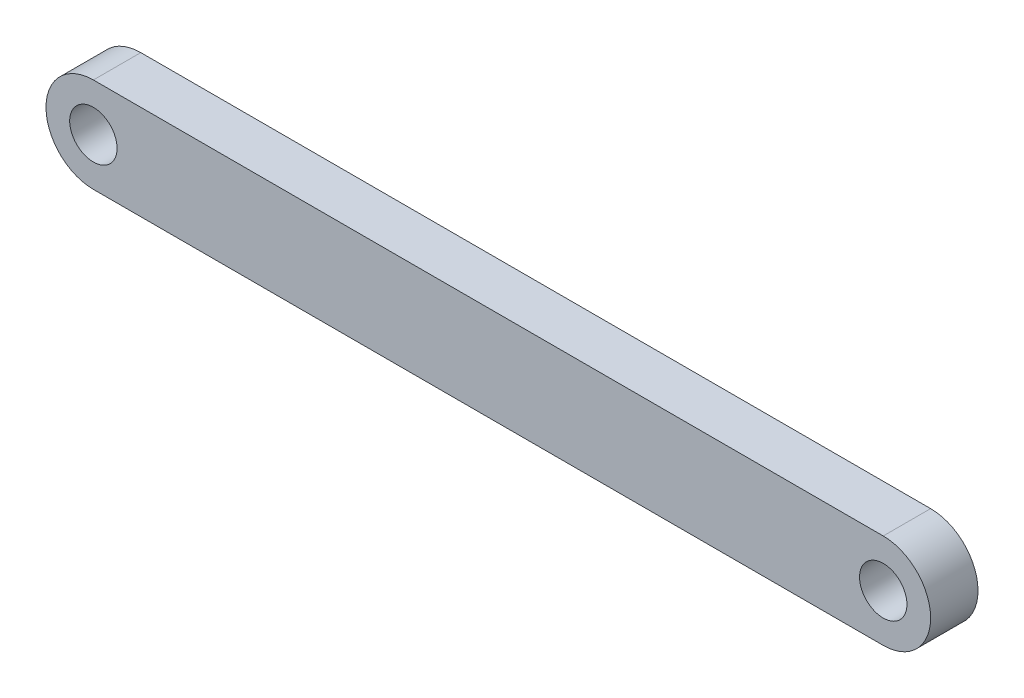
ISO-10303-21;
HEADER;
FILE_DESCRIPTION(('STEP AP214'),'2;1');
FILE_NAME('part.step','',(''),(''),'','','');
FILE_SCHEMA(('AUTOMOTIVE_DESIGN { 1 0 10303 214 1 1 1 1 }'));
ENDSEC;
DATA;
#1=APPLICATION_CONTEXT('core data for automotive mechanical design processes');
#2=APPLICATION_PROTOCOL_DEFINITION('international standard','automotive_design',2000,#1);
#3=PRODUCT_CONTEXT('',#1,'mechanical');
#4=PRODUCT('Part','Part','',(#3));
#5=PRODUCT_RELATED_PRODUCT_CATEGORY('part','',(#4));
#6=PRODUCT_DEFINITION_FORMATION('','',#4);
#7=PRODUCT_DEFINITION_CONTEXT('part definition',#1,'design');
#8=PRODUCT_DEFINITION('design','',#6,#7);
#9=PRODUCT_DEFINITION_SHAPE('','',#8);
#10=(LENGTH_UNIT() NAMED_UNIT(*) SI_UNIT(.MILLI.,.METRE.));
#11=(NAMED_UNIT(*) PLANE_ANGLE_UNIT() SI_UNIT($,.RADIAN.));
#12=(NAMED_UNIT(*) SI_UNIT($,.STERADIAN.) SOLID_ANGLE_UNIT());
#13=UNCERTAINTY_MEASURE_WITH_UNIT(LENGTH_MEASURE(1.E-05),#10,'distance_accuracy_value','');
#14=(GEOMETRIC_REPRESENTATION_CONTEXT(3) GLOBAL_UNCERTAINTY_ASSIGNED_CONTEXT((#13)) GLOBAL_UNIT_ASSIGNED_CONTEXT((#10,
#11,#12)) REPRESENTATION_CONTEXT('',''));
#15=CARTESIAN_POINT('',(0.,0.,0.));
#16=DIRECTION('',(0.,0.,1.));
#17=DIRECTION('',(1.,0.,0.));
#18=AXIS2_PLACEMENT_3D('',#15,#16,#17);
#19=CARTESIAN_POINT('',(0.,0.,3.));
#20=DIRECTION('',(0.,0.,1.));
#21=DIRECTION('',(1.,0.,0.));
#22=AXIS2_PLACEMENT_3D('',#19,#20,#21);
#23=PLANE('',#22);
#24=CARTESIAN_POINT('',(-50.,0.,3.));
#25=DIRECTION('',(0.,0.,1.));
#26=DIRECTION('',(1.,0.,0.));
#27=AXIS2_PLACEMENT_3D('',#24,#25,#26);
#28=CIRCLE('',#27,1.5);
#29=CARTESIAN_POINT('',(-48.5,0.,3.));
#30=VERTEX_POINT('',#29);
#31=EDGE_CURVE('E112',#30,#30,#28,.T.);
#32=ORIENTED_EDGE('',*,*,#31,.F.);
#33=EDGE_LOOP('',(#32));
#34=FACE_BOUND('',#33,.T.);
#35=CARTESIAN_POINT('',(0.,0.,3.));
#36=DIRECTION('',(0.,0.,1.));
#37=DIRECTION('',(1.,0.,0.));
#38=AXIS2_PLACEMENT_3D('',#35,#36,#37);
#39=CIRCLE('',#38,3.);
#40=CARTESIAN_POINT('',(0.,-3.,3.));
#41=VERTEX_POINT('',#40);
#42=CARTESIAN_POINT('',(0.,3.,3.));
#43=VERTEX_POINT('',#42);
#44=EDGE_CURVE('E92',#41,#43,#39,.T.);
#45=ORIENTED_EDGE('',*,*,#44,.T.);
#46=DIRECTION('',(-1.,0.,0.));
#47=VECTOR('',#46,1.);
#48=CARTESIAN_POINT('',(-50.,2.99999999999999,3.));
#49=LINE('',#48,#47);
#50=CARTESIAN_POINT('',(-50.,2.99999999999999,3.));
#51=VERTEX_POINT('',#50);
#52=EDGE_CURVE('E87',#43,#51,#49,.T.);
#53=ORIENTED_EDGE('',*,*,#52,.T.);
#54=CARTESIAN_POINT('',(-50.,0.,3.));
#55=DIRECTION('',(0.,0.,1.));
#56=DIRECTION('',(1.,0.,0.));
#57=AXIS2_PLACEMENT_3D('',#54,#55,#56);
#58=CIRCLE('',#57,3.);
#59=CARTESIAN_POINT('',(-50.,-3.00000000000001,3.));
#60=VERTEX_POINT('',#59);
#61=EDGE_CURVE('E90',#51,#60,#58,.T.);
#62=ORIENTED_EDGE('',*,*,#61,.T.);
#63=DIRECTION('',(1.,0.,0.));
#64=VECTOR('',#63,1.);
#65=CARTESIAN_POINT('',(-50.,-3.00000000000001,3.));
#66=LINE('',#65,#64);
#67=EDGE_CURVE('E57',#60,#41,#66,.T.);
#68=ORIENTED_EDGE('',*,*,#67,.T.);
#69=EDGE_LOOP('',(#45,#53,#62,#68));
#70=FACE_BOUND('',#69,.T.);
#71=CARTESIAN_POINT('',(0.,0.,3.));
#72=DIRECTION('',(0.,0.,1.));
#73=DIRECTION('',(1.,0.,0.));
#74=AXIS2_PLACEMENT_3D('',#71,#72,#73);
#75=CIRCLE('',#74,1.5);
#76=CARTESIAN_POINT('',(1.5,0.,3.));
#77=VERTEX_POINT('',#76);
#78=EDGE_CURVE('E134',#77,#77,#75,.T.);
#79=ORIENTED_EDGE('',*,*,#78,.F.);
#80=EDGE_LOOP('',(#79));
#81=FACE_BOUND('',#80,.T.);
#82=ADVANCED_FACE('F39',(#34,#70,#81),#23,.T.);
#83=CARTESIAN_POINT('',(0.,0.,0.));
#84=DIRECTION('',(0.,0.,1.));
#85=DIRECTION('',(1.,0.,0.));
#86=AXIS2_PLACEMENT_3D('',#83,#84,#85);
#87=PLANE('',#86);
#88=CARTESIAN_POINT('',(0.,0.,0.));
#89=DIRECTION('',(0.,0.,1.));
#90=DIRECTION('',(1.,0.,0.));
#91=AXIS2_PLACEMENT_3D('',#88,#89,#90);
#92=CIRCLE('',#91,3.);
#93=CARTESIAN_POINT('',(0.,-3.,0.));
#94=VERTEX_POINT('',#93);
#95=CARTESIAN_POINT('',(0.,3.,0.));
#96=VERTEX_POINT('',#95);
#97=EDGE_CURVE('E108',#94,#96,#92,.T.);
#98=ORIENTED_EDGE('',*,*,#97,.F.);
#99=DIRECTION('',(1.,0.,0.));
#100=VECTOR('',#99,1.);
#101=CARTESIAN_POINT('',(-50.,-3.00000000000001,0.));
#102=LINE('',#101,#100);
#103=CARTESIAN_POINT('',(-50.,-3.00000000000001,0.));
#104=VERTEX_POINT('',#103);
#105=EDGE_CURVE('E80',#104,#94,#102,.T.);
#106=ORIENTED_EDGE('',*,*,#105,.F.);
#107=CARTESIAN_POINT('',(-50.,0.,0.));
#108=DIRECTION('',(0.,0.,1.));
#109=DIRECTION('',(1.,0.,0.));
#110=AXIS2_PLACEMENT_3D('',#107,#108,#109);
#111=CIRCLE('',#110,3.);
#112=CARTESIAN_POINT('',(-50.,2.99999999999999,0.));
#113=VERTEX_POINT('',#112);
#114=EDGE_CURVE('E74',#113,#104,#111,.T.);
#115=ORIENTED_EDGE('',*,*,#114,.F.);
#116=DIRECTION('',(-1.,0.,0.));
#117=VECTOR('',#116,1.);
#118=CARTESIAN_POINT('',(-50.,2.99999999999999,0.));
#119=LINE('',#118,#117);
#120=EDGE_CURVE('E97',#96,#113,#119,.T.);
#121=ORIENTED_EDGE('',*,*,#120,.F.);
#122=EDGE_LOOP('',(#98,#106,#115,#121));
#123=FACE_BOUND('',#122,.T.);
#124=CARTESIAN_POINT('',(-50.,0.,0.));
#125=DIRECTION('',(0.,0.,1.));
#126=DIRECTION('',(1.,0.,0.));
#127=AXIS2_PLACEMENT_3D('',#124,#125,#126);
#128=CIRCLE('',#127,1.5);
#129=CARTESIAN_POINT('',(-48.5,0.,0.));
#130=VERTEX_POINT('',#129);
#131=EDGE_CURVE('E130',#130,#130,#128,.T.);
#132=ORIENTED_EDGE('',*,*,#131,.T.);
#133=EDGE_LOOP('',(#132));
#134=FACE_BOUND('',#133,.T.);
#135=CARTESIAN_POINT('',(0.,0.,0.));
#136=DIRECTION('',(0.,0.,1.));
#137=DIRECTION('',(1.,0.,0.));
#138=AXIS2_PLACEMENT_3D('',#135,#136,#137);
#139=CIRCLE('',#138,1.5);
#140=CARTESIAN_POINT('',(1.5,0.,0.));
#141=VERTEX_POINT('',#140);
#142=EDGE_CURVE('E138',#141,#141,#139,.T.);
#143=ORIENTED_EDGE('',*,*,#142,.T.);
#144=EDGE_LOOP('',(#143));
#145=FACE_BOUND('',#144,.T.);
#146=ADVANCED_FACE('F125',(#123,#134,#145),#87,.F.);
#147=CARTESIAN_POINT('',(0.,0.,3.));
#148=DIRECTION('',(0.,0.,-1.));
#149=DIRECTION('',(-1.,0.,0.));
#150=AXIS2_PLACEMENT_3D('',#147,#148,#149);
#151=CYLINDRICAL_SURFACE('',#150,3.);
#152=ORIENTED_EDGE('',*,*,#97,.T.);
#153=DIRECTION('',(0.,0.,-1.));
#154=VECTOR('',#153,1.);
#155=CARTESIAN_POINT('',(0.,3.,3.));
#156=LINE('',#155,#154);
#157=EDGE_CURVE('E11',#43,#96,#156,.T.);
#158=ORIENTED_EDGE('',*,*,#157,.F.);
#159=ORIENTED_EDGE('',*,*,#44,.F.);
#160=DIRECTION('',(0.,0.,-1.));
#161=VECTOR('',#160,1.);
#162=CARTESIAN_POINT('',(0.,-3.,3.));
#163=LINE('',#162,#161);
#164=EDGE_CURVE('E104',#41,#94,#163,.T.);
#165=ORIENTED_EDGE('',*,*,#164,.T.);
#166=EDGE_LOOP('',(#152,#158,#159,#165));
#167=FACE_BOUND('',#166,.T.);
#168=ADVANCED_FACE('F41',(#167),#151,.T.);
#169=CARTESIAN_POINT('',(-50.,2.99999999999999,3.));
#170=DIRECTION('',(0.,-1.,0.));
#171=DIRECTION('',(1.,0.,0.));
#172=AXIS2_PLACEMENT_3D('',#169,#170,#171);
#173=PLANE('',#172);
#174=ORIENTED_EDGE('',*,*,#120,.T.);
#175=DIRECTION('',(0.,0.,-1.));
#176=VECTOR('',#175,1.);
#177=CARTESIAN_POINT('',(-50.,2.99999999999999,3.));
#178=LINE('',#177,#176);
#179=EDGE_CURVE('E49',#51,#113,#178,.T.);
#180=ORIENTED_EDGE('',*,*,#179,.F.);
#181=ORIENTED_EDGE('',*,*,#52,.F.);
#182=ORIENTED_EDGE('',*,*,#157,.T.);
#183=EDGE_LOOP('',(#174,#180,#181,#182));
#184=FACE_BOUND('',#183,.T.);
#185=ADVANCED_FACE('F96',(#184),#173,.F.);
#186=CARTESIAN_POINT('',(-50.,0.,3.));
#187=DIRECTION('',(0.,0.,-1.));
#188=DIRECTION('',(-1.,0.,0.));
#189=AXIS2_PLACEMENT_3D('',#186,#187,#188);
#190=CYLINDRICAL_SURFACE('',#189,3.);
#191=ORIENTED_EDGE('',*,*,#114,.T.);
#192=DIRECTION('',(0.,0.,-1.));
#193=VECTOR('',#192,1.);
#194=CARTESIAN_POINT('',(-50.,-3.00000000000001,3.));
#195=LINE('',#194,#193);
#196=EDGE_CURVE('E99',#60,#104,#195,.T.);
#197=ORIENTED_EDGE('',*,*,#196,.F.);
#198=ORIENTED_EDGE('',*,*,#61,.F.);
#199=ORIENTED_EDGE('',*,*,#179,.T.);
#200=EDGE_LOOP('',(#191,#197,#198,#199));
#201=FACE_BOUND('',#200,.T.);
#202=ADVANCED_FACE('F100',(#201),#190,.T.);
#203=CARTESIAN_POINT('',(-50.,-3.00000000000001,3.));
#204=DIRECTION('',(0.,1.,0.));
#205=DIRECTION('',(-1.,0.,0.));
#206=AXIS2_PLACEMENT_3D('',#203,#204,#205);
#207=PLANE('',#206);
#208=ORIENTED_EDGE('',*,*,#105,.T.);
#209=ORIENTED_EDGE('',*,*,#164,.F.);
#210=ORIENTED_EDGE('',*,*,#67,.F.);
#211=ORIENTED_EDGE('',*,*,#196,.T.);
#212=EDGE_LOOP('',(#208,#209,#210,#211));
#213=FACE_BOUND('',#212,.T.);
#214=ADVANCED_FACE('F122',(#213),#207,.F.);
#215=CARTESIAN_POINT('',(-50.,0.,3.));
#216=DIRECTION('',(0.,0.,-1.));
#217=DIRECTION('',(-1.,0.,0.));
#218=AXIS2_PLACEMENT_3D('',#215,#216,#217);
#219=CYLINDRICAL_SURFACE('',#218,1.5);
#220=ORIENTED_EDGE('',*,*,#31,.T.);
#221=EDGE_LOOP('',(#220));
#222=FACE_BOUND('',#221,.T.);
#223=ORIENTED_EDGE('',*,*,#131,.F.);
#224=EDGE_LOOP('',(#223));
#225=FACE_BOUND('',#224,.T.);
#226=ADVANCED_FACE('F157',(#222,#225),#219,.F.);
#227=CARTESIAN_POINT('',(0.,0.,3.));
#228=DIRECTION('',(0.,0.,-1.));
#229=DIRECTION('',(-1.,0.,0.));
#230=AXIS2_PLACEMENT_3D('',#227,#228,#229);
#231=CYLINDRICAL_SURFACE('',#230,1.5);
#232=ORIENTED_EDGE('',*,*,#78,.T.);
#233=EDGE_LOOP('',(#232));
#234=FACE_BOUND('',#233,.T.);
#235=ORIENTED_EDGE('',*,*,#142,.F.);
#236=EDGE_LOOP('',(#235));
#237=FACE_BOUND('',#236,.T.);
#238=ADVANCED_FACE('F146',(#234,#237),#231,.F.);
#239=CLOSED_SHELL('',(#82,#146,#168,#185,#202,#214,#226,#238));
#240=MANIFOLD_SOLID_BREP('B2',#239);
#241=ADVANCED_BREP_SHAPE_REPRESENTATION('',(#18,#240),#14);
#242=SHAPE_DEFINITION_REPRESENTATION(#9,#241);
ENDSEC;
END-ISO-10303-21;
